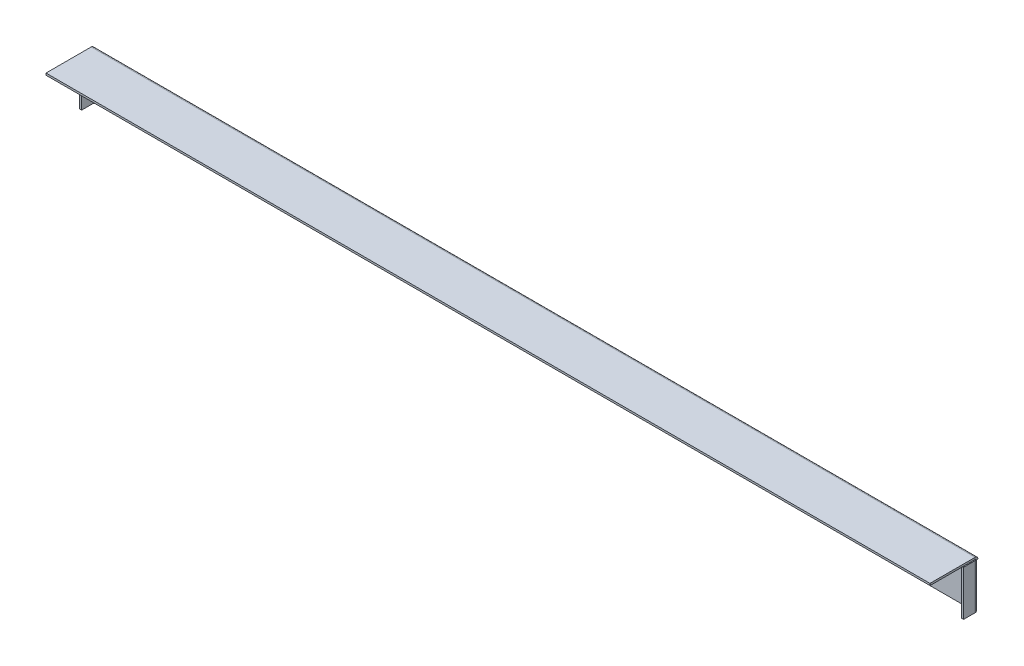
ISO-10303-21;
HEADER;
FILE_DESCRIPTION(('STEP AP214'),'2;1');
FILE_NAME('part.step','',(''),(''),'','','');
FILE_SCHEMA(('AUTOMOTIVE_DESIGN { 1 0 10303 214 1 1 1 1 }'));
ENDSEC;
DATA;
#1=APPLICATION_CONTEXT('core data for automotive mechanical design processes');
#2=APPLICATION_PROTOCOL_DEFINITION('international standard','automotive_design',2000,#1);
#3=PRODUCT_CONTEXT('',#1,'mechanical');
#4=PRODUCT('Part','Part','',(#3));
#5=PRODUCT_RELATED_PRODUCT_CATEGORY('part','',(#4));
#6=PRODUCT_DEFINITION_FORMATION('','',#4);
#7=PRODUCT_DEFINITION_CONTEXT('part definition',#1,'design');
#8=PRODUCT_DEFINITION('design','',#6,#7);
#9=PRODUCT_DEFINITION_SHAPE('','',#8);
#10=(LENGTH_UNIT() NAMED_UNIT(*) SI_UNIT(.MILLI.,.METRE.));
#11=(NAMED_UNIT(*) PLANE_ANGLE_UNIT() SI_UNIT($,.RADIAN.));
#12=(NAMED_UNIT(*) SI_UNIT($,.STERADIAN.) SOLID_ANGLE_UNIT());
#13=UNCERTAINTY_MEASURE_WITH_UNIT(LENGTH_MEASURE(1.E-05),#10,'distance_accuracy_value','');
#14=(GEOMETRIC_REPRESENTATION_CONTEXT(3) GLOBAL_UNCERTAINTY_ASSIGNED_CONTEXT((#13)) GLOBAL_UNIT_ASSIGNED_CONTEXT((#10,
#11,#12)) REPRESENTATION_CONTEXT('',''));
#15=CARTESIAN_POINT('',(0.,0.,0.));
#16=DIRECTION('',(0.,0.,1.));
#17=DIRECTION('',(1.,0.,0.));
#18=AXIS2_PLACEMENT_3D('',#15,#16,#17);
#19=CARTESIAN_POINT('',(-457.,-3.00000000000011,1.99999999999995));
#20=DIRECTION('',(0.,-1.,0.));
#21=DIRECTION('',(0.,0.,-1.));
#22=AXIS2_PLACEMENT_3D('',#19,#20,#21);
#23=PLANE('',#22);
#24=DIRECTION('',(-1.,0.,0.));
#25=VECTOR('',#24,1.);
#26=CARTESIAN_POINT('',(-460.,-3.00000000000012,0.));
#27=LINE('',#26,#25);
#28=CARTESIAN_POINT('',(-460.,-3.00000000000011,0.));
#29=VERTEX_POINT('',#28);
#30=CARTESIAN_POINT('',(-457.,-3.00000000000011,0.));
#31=VERTEX_POINT('',#30);
#32=EDGE_CURVE('E385',#29,#31,#27,.F.);
#33=ORIENTED_EDGE('',*,*,#32,.T.);
#34=CARTESIAN_POINT('',(-457.,-3.00000000000011,3.00000000000001));
#35=DIRECTION('',(0.,-1.,0.));
#36=DIRECTION('',(0.,0.,-1.));
#37=AXIS2_PLACEMENT_3D('',#34,#35,#36);
#38=CIRCLE('',#37,3.00000000000006);
#39=CARTESIAN_POINT('',(-459.828427124746,-3.00000000000011,2.));
#40=VERTEX_POINT('',#39);
#41=EDGE_CURVE('E284',#31,#40,#38,.F.);
#42=ORIENTED_EDGE('',*,*,#41,.T.);
#43=DIRECTION('',(-1.,0.,0.));
#44=VECTOR('',#43,1.);
#45=CARTESIAN_POINT('',(-460.,-3.00000000000012,2.));
#46=LINE('',#45,#44);
#47=CARTESIAN_POINT('',(-460.,-3.00000000000012,2.));
#48=VERTEX_POINT('',#47);
#49=EDGE_CURVE('E399',#48,#40,#46,.F.);
#50=ORIENTED_EDGE('',*,*,#49,.F.);
#51=DIRECTION('',(0.,0.,-1.));
#52=VECTOR('',#51,1.);
#53=CARTESIAN_POINT('',(-460.,-3.00000000000012,2.));
#54=LINE('',#53,#52);
#55=EDGE_CURVE('E392',#48,#29,#54,.T.);
#56=ORIENTED_EDGE('',*,*,#55,.T.);
#57=EDGE_LOOP('',(#33,#42,#50,#56));
#58=FACE_BOUND('',#57,.T.);
#59=ADVANCED_FACE('F99',(#58),#23,.T.);
#60=CARTESIAN_POINT('',(460.,-3.00000000000012,2.));
#61=DIRECTION('',(0.,-1.,0.));
#62=DIRECTION('',(0.,0.,-1.));
#63=AXIS2_PLACEMENT_3D('',#60,#61,#62);
#64=PLANE('',#63);
#65=DIRECTION('',(-1.,0.,0.));
#66=VECTOR('',#65,1.);
#67=CARTESIAN_POINT('',(460.,-3.00000000000012,2.));
#68=LINE('',#67,#66);
#69=CARTESIAN_POINT('',(460.,-3.00000000000012,2.));
#70=VERTEX_POINT('',#69);
#71=CARTESIAN_POINT('',(459.828427124746,-3.00000000000012,2.));
#72=VERTEX_POINT('',#71);
#73=EDGE_CURVE('E348',#70,#72,#68,.T.);
#74=ORIENTED_EDGE('',*,*,#73,.T.);
#75=CARTESIAN_POINT('',(457.,-3.00000000000012,3.00000000000001));
#76=DIRECTION('',(0.,1.,0.));
#77=DIRECTION('',(0.,0.,1.));
#78=AXIS2_PLACEMENT_3D('',#75,#76,#77);
#79=CIRCLE('',#78,3.);
#80=CARTESIAN_POINT('',(457.,-3.00000000000011,0.));
#81=VERTEX_POINT('',#80);
#82=EDGE_CURVE('E13',#72,#81,#79,.T.);
#83=ORIENTED_EDGE('',*,*,#82,.T.);
#84=DIRECTION('',(-1.,0.,0.));
#85=VECTOR('',#84,1.);
#86=CARTESIAN_POINT('',(-460.,-2.99999999999971,0.));
#87=LINE('',#86,#85);
#88=CARTESIAN_POINT('',(460.,-3.00000000000011,0.));
#89=VERTEX_POINT('',#88);
#90=EDGE_CURVE('E350',#89,#81,#87,.T.);
#91=ORIENTED_EDGE('',*,*,#90,.F.);
#92=DIRECTION('',(0.,0.,-1.));
#93=VECTOR('',#92,1.);
#94=CARTESIAN_POINT('',(460.,-3.00000000000012,2.));
#95=LINE('',#94,#93);
#96=EDGE_CURVE('E406',#70,#89,#95,.T.);
#97=ORIENTED_EDGE('',*,*,#96,.F.);
#98=EDGE_LOOP('',(#74,#83,#91,#97));
#99=FACE_BOUND('',#98,.T.);
#100=ADVANCED_FACE('F460',(#99),#64,.T.);
#101=CARTESIAN_POINT('',(0.,0.,2.));
#102=DIRECTION('',(0.,0.,-1.));
#103=DIRECTION('',(-1.,0.,0.));
#104=AXIS2_PLACEMENT_3D('',#101,#102,#103);
#105=PLANE('',#104);
#106=DIRECTION('',(0.,-1.,0.));
#107=VECTOR('',#106,1.);
#108=CARTESIAN_POINT('',(-457.,-50.0000000000001,1.99999999999995));
#109=LINE('',#108,#107);
#110=CARTESIAN_POINT('',(-457.,-50.0000000000001,1.99999999999995));
#111=VERTEX_POINT('',#110);
#112=CARTESIAN_POINT('',(-457.,-3.00000000000012,2.));
#113=VERTEX_POINT('',#112);
#114=EDGE_CURVE('E291',#111,#113,#109,.F.);
#115=ORIENTED_EDGE('',*,*,#114,.F.);
#116=DIRECTION('',(1.,0.,0.));
#117=VECTOR('',#116,1.);
#118=CARTESIAN_POINT('',(460.,-50.0000000000001,2.));
#119=LINE('',#118,#117);
#120=CARTESIAN_POINT('',(457.,-50.0000000000001,2.00000000000001));
#121=VERTEX_POINT('',#120);
#122=EDGE_CURVE('E108',#111,#121,#119,.T.);
#123=ORIENTED_EDGE('',*,*,#122,.T.);
#124=DIRECTION('',(0.,1.,0.));
#125=VECTOR('',#124,1.);
#126=CARTESIAN_POINT('',(457.,-3.00000000000012,2.00000000000001));
#127=LINE('',#126,#125);
#128=CARTESIAN_POINT('',(457.,-3.00000000000012,2.00000000000001));
#129=VERTEX_POINT('',#128);
#130=EDGE_CURVE('E341',#129,#121,#127,.F.);
#131=ORIENTED_EDGE('',*,*,#130,.F.);
#132=EDGE_CURVE('E403',#113,#129,#46,.F.);
#133=ORIENTED_EDGE('',*,*,#132,.F.);
#134=EDGE_LOOP('',(#115,#123,#131,#133));
#135=FACE_BOUND('',#134,.T.);
#136=ADVANCED_FACE('F467',(#135),#105,.F.);
#137=CARTESIAN_POINT('',(0.,0.,0.));
#138=DIRECTION('',(0.,0.,-1.));
#139=DIRECTION('',(-1.,0.,0.));
#140=AXIS2_PLACEMENT_3D('',#137,#138,#139);
#141=PLANE('',#140);
#142=DIRECTION('',(1.,0.,0.));
#143=VECTOR('',#142,1.);
#144=CARTESIAN_POINT('',(460.,-50.0000000000001,0.));
#145=LINE('',#144,#143);
#146=CARTESIAN_POINT('',(-457.,-50.0000000000001,0.));
#147=VERTEX_POINT('',#146);
#148=CARTESIAN_POINT('',(457.,-50.0000000000001,0.));
#149=VERTEX_POINT('',#148);
#150=EDGE_CURVE('E103',#147,#149,#145,.T.);
#151=ORIENTED_EDGE('',*,*,#150,.F.);
#152=DIRECTION('',(0.,-1.,0.));
#153=VECTOR('',#152,1.);
#154=CARTESIAN_POINT('',(-457.,-50.0000000000001,0.));
#155=LINE('',#154,#153);
#156=EDGE_CURVE('E279',#147,#31,#155,.F.);
#157=ORIENTED_EDGE('',*,*,#156,.T.);
#158=EDGE_CURVE('E389',#31,#81,#27,.F.);
#159=ORIENTED_EDGE('',*,*,#158,.T.);
#160=DIRECTION('',(0.,1.,0.));
#161=VECTOR('',#160,1.);
#162=CARTESIAN_POINT('',(457.,-3.00000000000012,0.));
#163=LINE('',#162,#161);
#164=EDGE_CURVE('E330',#81,#149,#163,.F.);
#165=ORIENTED_EDGE('',*,*,#164,.T.);
#166=EDGE_LOOP('',(#151,#157,#159,#165));
#167=FACE_BOUND('',#166,.T.);
#168=ADVANCED_FACE('F418',(#167),#141,.T.);
#169=CARTESIAN_POINT('',(460.,-50.0000000000001,2.));
#170=DIRECTION('',(0.,1.,0.));
#171=DIRECTION('',(0.,0.,1.));
#172=AXIS2_PLACEMENT_3D('',#169,#170,#171);
#173=PLANE('',#172);
#174=DIRECTION('',(0.,0.,-1.));
#175=VECTOR('',#174,1.);
#176=CARTESIAN_POINT('',(-457.,-50.0000000000001,1.99999999999995));
#177=LINE('',#176,#175);
#178=EDGE_CURVE('E287',#111,#147,#177,.T.);
#179=ORIENTED_EDGE('',*,*,#178,.T.);
#180=ORIENTED_EDGE('',*,*,#150,.T.);
#181=DIRECTION('',(0.,0.,-1.));
#182=VECTOR('',#181,1.);
#183=CARTESIAN_POINT('',(457.,-50.0000000000001,2.00000000000001));
#184=LINE('',#183,#182);
#185=EDGE_CURVE('E335',#121,#149,#184,.T.);
#186=ORIENTED_EDGE('',*,*,#185,.F.);
#187=ORIENTED_EDGE('',*,*,#122,.F.);
#188=EDGE_LOOP('',(#179,#180,#186,#187));
#189=FACE_BOUND('',#188,.T.);
#190=ADVANCED_FACE('F101',(#189),#173,.F.);
#191=CARTESIAN_POINT('',(460.,-3.00000000000012,3.));
#192=DIRECTION('',(1.,0.,0.));
#193=DIRECTION('',(0.,0.,-1.));
#194=AXIS2_PLACEMENT_3D('',#191,#192,#193);
#195=PLANE('',#194);
#196=DIRECTION('',(0.,1.,0.));
#197=VECTOR('',#196,1.);
#198=CARTESIAN_POINT('',(460.,-1.21408608931487E-13,2.99999999999999));
#199=LINE('',#198,#197);
#200=CARTESIAN_POINT('',(460.,-2.00000000000012,3.));
#201=VERTEX_POINT('',#200);
#202=CARTESIAN_POINT('',(460.,-1.21430643318376E-13,2.99999999999999));
#203=VERTEX_POINT('',#202);
#204=EDGE_CURVE('E353',#201,#203,#199,.T.);
#205=ORIENTED_EDGE('',*,*,#204,.F.);
#206=CARTESIAN_POINT('',(460.,-3.00000000000012,3.));
#207=DIRECTION('',(-1.,0.,0.));
#208=DIRECTION('',(0.,0.,1.));
#209=AXIS2_PLACEMENT_3D('',#206,#207,#208);
#210=CIRCLE('',#209,1.);
#211=EDGE_CURVE('E396',#70,#201,#210,.F.);
#212=ORIENTED_EDGE('',*,*,#211,.F.);
#213=ORIENTED_EDGE('',*,*,#96,.T.);
#214=CARTESIAN_POINT('',(460.,-3.00000000000012,3.));
#215=DIRECTION('',(-1.,0.,0.));
#216=DIRECTION('',(0.,0.,1.));
#217=AXIS2_PLACEMENT_3D('',#214,#215,#216);
#218=CIRCLE('',#217,3.);
#219=EDGE_CURVE('E388',#89,#203,#218,.F.);
#220=ORIENTED_EDGE('',*,*,#219,.T.);
#221=EDGE_LOOP('',(#205,#212,#213,#220));
#222=FACE_BOUND('',#221,.T.);
#223=ADVANCED_FACE('F502',(#222),#195,.T.);
#224=CARTESIAN_POINT('',(-460.,-3.00000000000012,3.));
#225=DIRECTION('',(1.,0.,0.));
#226=DIRECTION('',(0.,0.,-1.));
#227=AXIS2_PLACEMENT_3D('',#224,#225,#226);
#228=PLANE('',#227);
#229=CARTESIAN_POINT('',(-460.,-3.00000000000012,3.));
#230=DIRECTION('',(-1.,0.,0.));
#231=DIRECTION('',(0.,0.,1.));
#232=AXIS2_PLACEMENT_3D('',#229,#230,#231);
#233=CIRCLE('',#232,1.);
#234=CARTESIAN_POINT('',(-460.,-2.00000000000012,3.));
#235=VERTEX_POINT('',#234);
#236=EDGE_CURVE('E356',#235,#48,#233,.T.);
#237=ORIENTED_EDGE('',*,*,#236,.F.);
#238=DIRECTION('',(0.,1.,0.));
#239=VECTOR('',#238,1.);
#240=CARTESIAN_POINT('',(-460.,-2.00000000000012,3.00000000000001));
#241=LINE('',#240,#239);
#242=CARTESIAN_POINT('',(-460.,-1.21305697310961E-13,3.));
#243=VERTEX_POINT('',#242);
#244=EDGE_CURVE('E378',#235,#243,#241,.T.);
#245=ORIENTED_EDGE('',*,*,#244,.T.);
#246=CARTESIAN_POINT('',(-460.,-3.00000000000012,3.));
#247=DIRECTION('',(-1.,0.,0.));
#248=DIRECTION('',(0.,0.,1.));
#249=AXIS2_PLACEMENT_3D('',#246,#247,#248);
#250=CIRCLE('',#249,3.);
#251=EDGE_CURVE('E393',#243,#29,#250,.T.);
#252=ORIENTED_EDGE('',*,*,#251,.T.);
#253=ORIENTED_EDGE('',*,*,#55,.F.);
#254=EDGE_LOOP('',(#237,#245,#252,#253));
#255=FACE_BOUND('',#254,.T.);
#256=ADVANCED_FACE('F498',(#255),#228,.F.);
#257=CARTESIAN_POINT('',(-460.,-3.00000000000012,3.));
#258=DIRECTION('',(-1.,0.,0.));
#259=DIRECTION('',(0.,1.,0.));
#260=AXIS2_PLACEMENT_3D('',#257,#258,#259);
#261=CYLINDRICAL_SURFACE('',#260,3.);
#262=ORIENTED_EDGE('',*,*,#32,.F.);
#263=ORIENTED_EDGE('',*,*,#251,.F.);
#264=DIRECTION('',(-1.,0.,0.));
#265=VECTOR('',#264,1.);
#266=CARTESIAN_POINT('',(460.,-1.21430643318376E-13,2.99999999999999));
#267=LINE('',#266,#265);
#268=EDGE_CURVE('E376',#243,#203,#267,.F.);
#269=ORIENTED_EDGE('',*,*,#268,.T.);
#270=ORIENTED_EDGE('',*,*,#219,.F.);
#271=ORIENTED_EDGE('',*,*,#90,.T.);
#272=ORIENTED_EDGE('',*,*,#158,.F.);
#273=EDGE_LOOP('',(#262,#263,#269,#270,#271,#272));
#274=FACE_BOUND('',#273,.T.);
#275=ADVANCED_FACE('F495',(#274),#261,.T.);
#276=CARTESIAN_POINT('',(-460.,-3.00000000000012,3.));
#277=DIRECTION('',(-1.,0.,0.));
#278=DIRECTION('',(0.,1.,0.));
#279=AXIS2_PLACEMENT_3D('',#276,#277,#278);
#280=CYLINDRICAL_SURFACE('',#279,1.);
#281=ORIENTED_EDGE('',*,*,#49,.T.);
#282=EDGE_CURVE('E402',#40,#113,#46,.F.);
#283=ORIENTED_EDGE('',*,*,#282,.T.);
#284=ORIENTED_EDGE('',*,*,#132,.T.);
#285=EDGE_CURVE('E117',#72,#129,#68,.T.);
#286=ORIENTED_EDGE('',*,*,#285,.F.);
#287=ORIENTED_EDGE('',*,*,#73,.F.);
#288=ORIENTED_EDGE('',*,*,#211,.T.);
#289=DIRECTION('',(-1.,0.,0.));
#290=VECTOR('',#289,1.);
#291=CARTESIAN_POINT('',(460.,-2.00000000000012,3.));
#292=LINE('',#291,#290);
#293=EDGE_CURVE('E381',#201,#235,#292,.T.);
#294=ORIENTED_EDGE('',*,*,#293,.T.);
#295=ORIENTED_EDGE('',*,*,#236,.T.);
#296=EDGE_LOOP('',(#281,#283,#284,#286,#287,#288,#294,#295));
#297=FACE_BOUND('',#296,.T.);
#298=ADVANCED_FACE('F487',(#297),#280,.F.);
#299=CARTESIAN_POINT('',(-460.,0.,50.));
#300=DIRECTION('',(-1.,0.,0.));
#301=DIRECTION('',(0.,0.,1.));
#302=AXIS2_PLACEMENT_3D('',#299,#300,#301);
#303=PLANE('',#302);
#304=DIRECTION('',(0.,0.,1.));
#305=VECTOR('',#304,1.);
#306=CARTESIAN_POINT('',(-460.,0.,50.));
#307=LINE('',#306,#305);
#308=CARTESIAN_POINT('',(-460.,0.,50.));
#309=VERTEX_POINT('',#308);
#310=EDGE_CURVE('E360',#309,#243,#307,.F.);
#311=ORIENTED_EDGE('',*,*,#310,.T.);
#312=ORIENTED_EDGE('',*,*,#244,.F.);
#313=DIRECTION('',(0.,0.,-1.));
#314=VECTOR('',#313,1.);
#315=CARTESIAN_POINT('',(-460.,-2.00000000000013,0.));
#316=LINE('',#315,#314);
#317=CARTESIAN_POINT('',(-460.,-1.99999999999996,50.));
#318=VERTEX_POINT('',#317);
#319=EDGE_CURVE('E368',#318,#235,#316,.T.);
#320=ORIENTED_EDGE('',*,*,#319,.F.);
#321=DIRECTION('',(0.,-1.,0.));
#322=VECTOR('',#321,1.);
#323=CARTESIAN_POINT('',(-460.,0.,50.));
#324=LINE('',#323,#322);
#325=EDGE_CURVE('E354',#309,#318,#324,.T.);
#326=ORIENTED_EDGE('',*,*,#325,.F.);
#327=EDGE_LOOP('',(#311,#312,#320,#326));
#328=FACE_BOUND('',#327,.T.);
#329=ADVANCED_FACE('F484',(#328),#303,.T.);
#330=CARTESIAN_POINT('',(460.,-1.2490009027033E-13,1.99999999999999));
#331=DIRECTION('',(1.,0.,0.));
#332=DIRECTION('',(0.,0.,-1.));
#333=AXIS2_PLACEMENT_3D('',#330,#331,#332);
#334=PLANE('',#333);
#335=DIRECTION('',(0.,0.,1.));
#336=VECTOR('',#335,1.);
#337=CARTESIAN_POINT('',(460.,-2.00000000000013,0.));
#338=LINE('',#337,#336);
#339=CARTESIAN_POINT('',(460.,-1.99999999999996,50.));
#340=VERTEX_POINT('',#339);
#341=EDGE_CURVE('E374',#201,#340,#338,.T.);
#342=ORIENTED_EDGE('',*,*,#341,.F.);
#343=ORIENTED_EDGE('',*,*,#204,.T.);
#344=DIRECTION('',(0.,0.,-1.));
#345=VECTOR('',#344,1.);
#346=CARTESIAN_POINT('',(460.,-1.24856021496551E-13,1.99999999999999));
#347=LINE('',#346,#345);
#348=CARTESIAN_POINT('',(460.,0.,50.));
#349=VERTEX_POINT('',#348);
#350=EDGE_CURVE('E366',#203,#349,#347,.F.);
#351=ORIENTED_EDGE('',*,*,#350,.T.);
#352=DIRECTION('',(0.,-1.,0.));
#353=VECTOR('',#352,1.);
#354=CARTESIAN_POINT('',(460.,0.,50.));
#355=LINE('',#354,#353);
#356=EDGE_CURVE('E357',#349,#340,#355,.T.);
#357=ORIENTED_EDGE('',*,*,#356,.T.);
#358=EDGE_LOOP('',(#342,#343,#351,#357));
#359=FACE_BOUND('',#358,.T.);
#360=ADVANCED_FACE('F478',(#359),#334,.T.);
#361=CARTESIAN_POINT('',(0.,-1.31838984174237E-13,0.));
#362=DIRECTION('',(0.,-1.,0.));
#363=DIRECTION('',(0.,0.,-1.));
#364=AXIS2_PLACEMENT_3D('',#361,#362,#363);
#365=PLANE('',#364);
#366=ORIENTED_EDGE('',*,*,#268,.F.);
#367=ORIENTED_EDGE('',*,*,#310,.F.);
#368=DIRECTION('',(1.,0.,0.));
#369=VECTOR('',#368,1.);
#370=CARTESIAN_POINT('',(460.,0.,50.));
#371=LINE('',#370,#369);
#372=EDGE_CURVE('E363',#349,#309,#371,.F.);
#373=ORIENTED_EDGE('',*,*,#372,.F.);
#374=ORIENTED_EDGE('',*,*,#350,.F.);
#375=EDGE_LOOP('',(#366,#367,#373,#374));
#376=FACE_BOUND('',#375,.T.);
#377=ADVANCED_FACE('F474',(#376),#365,.F.);
#378=CARTESIAN_POINT('',(0.,-2.00000000000013,0.));
#379=DIRECTION('',(0.,-1.,0.));
#380=DIRECTION('',(0.,0.,-1.));
#381=AXIS2_PLACEMENT_3D('',#378,#379,#380);
#382=PLANE('',#381);
#383=ORIENTED_EDGE('',*,*,#319,.T.);
#384=ORIENTED_EDGE('',*,*,#293,.F.);
#385=ORIENTED_EDGE('',*,*,#341,.T.);
#386=DIRECTION('',(-1.,0.,0.));
#387=VECTOR('',#386,1.);
#388=CARTESIAN_POINT('',(0.,-1.99999999999996,50.));
#389=LINE('',#388,#387);
#390=EDGE_CURVE('E371',#340,#318,#389,.T.);
#391=ORIENTED_EDGE('',*,*,#390,.T.);
#392=EDGE_LOOP('',(#383,#384,#385,#391));
#393=FACE_BOUND('',#392,.T.);
#394=ADVANCED_FACE('F477',(#393),#382,.T.);
#395=CARTESIAN_POINT('',(460.,0.,50.));
#396=DIRECTION('',(0.,0.,1.));
#397=DIRECTION('',(0.,-1.,0.));
#398=AXIS2_PLACEMENT_3D('',#395,#396,#397);
#399=PLANE('',#398);
#400=ORIENTED_EDGE('',*,*,#390,.F.);
#401=ORIENTED_EDGE('',*,*,#356,.F.);
#402=ORIENTED_EDGE('',*,*,#372,.T.);
#403=ORIENTED_EDGE('',*,*,#325,.T.);
#404=EDGE_LOOP('',(#400,#401,#402,#403));
#405=FACE_BOUND('',#404,.T.);
#406=ADVANCED_FACE('F482',(#405),#399,.T.);
#407=CARTESIAN_POINT('',(457.,-50.0000000000001,3.00000000000001));
#408=DIRECTION('',(0.,-1.,0.));
#409=DIRECTION('',(0.,0.,-1.));
#410=AXIS2_PLACEMENT_3D('',#407,#408,#409);
#411=PLANE('',#410);
#412=DIRECTION('',(1.,0.,0.));
#413=VECTOR('',#412,1.);
#414=CARTESIAN_POINT('',(460.,-50.0000000000001,2.99999999999999));
#415=LINE('',#414,#413);
#416=CARTESIAN_POINT('',(458.,-50.0000000000001,3.));
#417=VERTEX_POINT('',#416);
#418=CARTESIAN_POINT('',(460.,-50.0000000000001,2.99999999999999));
#419=VERTEX_POINT('',#418);
#420=EDGE_CURVE('E297',#417,#419,#415,.T.);
#421=ORIENTED_EDGE('',*,*,#420,.F.);
#422=CARTESIAN_POINT('',(457.,-50.0000000000001,3.00000000000001));
#423=DIRECTION('',(0.,1.,0.));
#424=DIRECTION('',(0.,0.,1.));
#425=AXIS2_PLACEMENT_3D('',#422,#423,#424);
#426=CIRCLE('',#425,1.);
#427=EDGE_CURVE('E338',#121,#417,#426,.F.);
#428=ORIENTED_EDGE('',*,*,#427,.F.);
#429=ORIENTED_EDGE('',*,*,#185,.T.);
#430=CARTESIAN_POINT('',(457.,-50.0000000000001,3.00000000000001));
#431=DIRECTION('',(0.,1.,0.));
#432=DIRECTION('',(0.,0.,1.));
#433=AXIS2_PLACEMENT_3D('',#430,#431,#432);
#434=CIRCLE('',#433,3.);
#435=EDGE_CURVE('E333',#149,#419,#434,.F.);
#436=ORIENTED_EDGE('',*,*,#435,.T.);
#437=EDGE_LOOP('',(#421,#428,#429,#436));
#438=FACE_BOUND('',#437,.T.);
#439=ADVANCED_FACE('F425',(#438),#411,.T.);
#440=CARTESIAN_POINT('',(457.,-3.00000000000012,3.00000000000001));
#441=DIRECTION('',(0.,-1.,0.));
#442=DIRECTION('',(0.,0.,-1.));
#443=AXIS2_PLACEMENT_3D('',#440,#441,#442);
#444=PLANE('',#443);
#445=CARTESIAN_POINT('',(460.,-3.00000000000012,2.99999999999999));
#446=VERTEX_POINT('',#445);
#447=EDGE_CURVE('E110',#446,#72,#79,.T.);
#448=ORIENTED_EDGE('',*,*,#447,.T.);
#449=ORIENTED_EDGE('',*,*,#285,.T.);
#450=CARTESIAN_POINT('',(457.,-3.00000000000012,3.00000000000001));
#451=DIRECTION('',(0.,1.,0.));
#452=DIRECTION('',(0.,0.,1.));
#453=AXIS2_PLACEMENT_3D('',#450,#451,#452);
#454=CIRCLE('',#453,1.);
#455=CARTESIAN_POINT('',(458.,-3.00000000000012,3.));
#456=VERTEX_POINT('',#455);
#457=EDGE_CURVE('E300',#456,#129,#454,.T.);
#458=ORIENTED_EDGE('',*,*,#457,.F.);
#459=DIRECTION('',(1.,0.,0.));
#460=VECTOR('',#459,1.);
#461=CARTESIAN_POINT('',(458.,-3.00000000000012,3.));
#462=LINE('',#461,#460);
#463=EDGE_CURVE('E323',#456,#446,#462,.T.);
#464=ORIENTED_EDGE('',*,*,#463,.T.);
#465=EDGE_LOOP('',(#448,#449,#458,#464));
#466=FACE_BOUND('',#465,.T.);
#467=ADVANCED_FACE('F471',(#466),#444,.F.);
#468=CARTESIAN_POINT('',(457.,-3.00000000000012,3.00000000000001));
#469=DIRECTION('',(0.,1.,0.));
#470=DIRECTION('',(1.,0.,0.));
#471=AXIS2_PLACEMENT_3D('',#468,#469,#470);
#472=CYLINDRICAL_SURFACE('',#471,3.);
#473=ORIENTED_EDGE('',*,*,#164,.F.);
#474=ORIENTED_EDGE('',*,*,#82,.F.);
#475=ORIENTED_EDGE('',*,*,#447,.F.);
#476=DIRECTION('',(0.,1.,0.));
#477=VECTOR('',#476,1.);
#478=CARTESIAN_POINT('',(460.,-5.43300629071885E-13,2.99999999999999));
#479=LINE('',#478,#477);
#480=EDGE_CURVE('E320',#419,#446,#479,.T.);
#481=ORIENTED_EDGE('',*,*,#480,.F.);
#482=ORIENTED_EDGE('',*,*,#435,.F.);
#483=EDGE_LOOP('',(#473,#474,#475,#481,#482));
#484=FACE_BOUND('',#483,.T.);
#485=ADVANCED_FACE('F426',(#484),#472,.T.);
#486=CARTESIAN_POINT('',(457.,-3.00000000000012,3.00000000000001));
#487=DIRECTION('',(0.,1.,0.));
#488=DIRECTION('',(1.,0.,0.));
#489=AXIS2_PLACEMENT_3D('',#486,#487,#488);
#490=CYLINDRICAL_SURFACE('',#489,1.);
#491=ORIENTED_EDGE('',*,*,#130,.T.);
#492=ORIENTED_EDGE('',*,*,#427,.T.);
#493=DIRECTION('',(0.,-1.,0.));
#494=VECTOR('',#493,1.);
#495=CARTESIAN_POINT('',(458.,-50.0000000000001,3.));
#496=LINE('',#495,#494);
#497=EDGE_CURVE('E326',#417,#456,#496,.F.);
#498=ORIENTED_EDGE('',*,*,#497,.T.);
#499=ORIENTED_EDGE('',*,*,#457,.T.);
#500=EDGE_LOOP('',(#491,#492,#498,#499));
#501=FACE_BOUND('',#500,.T.);
#502=ADVANCED_FACE('F445',(#501),#490,.F.);
#503=CARTESIAN_POINT('',(460.,-3.00000000000012,2.));
#504=DIRECTION('',(0.,1.,0.));
#505=DIRECTION('',(-1.,0.,0.));
#506=AXIS2_PLACEMENT_3D('',#503,#504,#505);
#507=PLANE('',#506);
#508=DIRECTION('',(0.,0.,-1.));
#509=VECTOR('',#508,1.);
#510=CARTESIAN_POINT('',(460.,-3.00000000000012,2.));
#511=LINE('',#510,#509);
#512=CARTESIAN_POINT('',(460.,-3.00000000000012,15.));
#513=VERTEX_POINT('',#512);
#514=EDGE_CURVE('E304',#513,#446,#511,.T.);
#515=ORIENTED_EDGE('',*,*,#514,.T.);
#516=ORIENTED_EDGE('',*,*,#463,.F.);
#517=DIRECTION('',(0.,0.,1.));
#518=VECTOR('',#517,1.);
#519=CARTESIAN_POINT('',(458.,-3.00000000000012,-1.9640405754742E-12));
#520=LINE('',#519,#518);
#521=CARTESIAN_POINT('',(458.,-3.00000000000012,15.));
#522=VERTEX_POINT('',#521);
#523=EDGE_CURVE('E312',#522,#456,#520,.F.);
#524=ORIENTED_EDGE('',*,*,#523,.F.);
#525=DIRECTION('',(-1.,0.,0.));
#526=VECTOR('',#525,1.);
#527=CARTESIAN_POINT('',(460.,-3.00000000000012,15.));
#528=LINE('',#527,#526);
#529=EDGE_CURVE('E298',#513,#522,#528,.T.);
#530=ORIENTED_EDGE('',*,*,#529,.F.);
#531=EDGE_LOOP('',(#515,#516,#524,#530));
#532=FACE_BOUND('',#531,.T.);
#533=ADVANCED_FACE('F434',(#532),#507,.T.);
#534=CARTESIAN_POINT('',(460.,-50.0000000000001,15.));
#535=DIRECTION('',(0.,-1.,0.));
#536=DIRECTION('',(1.,0.,0.));
#537=AXIS2_PLACEMENT_3D('',#534,#535,#536);
#538=PLANE('',#537);
#539=DIRECTION('',(0.,0.,-1.));
#540=VECTOR('',#539,1.);
#541=CARTESIAN_POINT('',(458.,-50.0000000000001,-1.96424073587528E-12));
#542=LINE('',#541,#540);
#543=CARTESIAN_POINT('',(458.,-50.0000000000001,15.));
#544=VERTEX_POINT('',#543);
#545=EDGE_CURVE('E318',#417,#544,#542,.F.);
#546=ORIENTED_EDGE('',*,*,#545,.F.);
#547=ORIENTED_EDGE('',*,*,#420,.T.);
#548=DIRECTION('',(0.,0.,1.));
#549=VECTOR('',#548,1.);
#550=CARTESIAN_POINT('',(460.,-50.0000000000001,15.));
#551=LINE('',#550,#549);
#552=CARTESIAN_POINT('',(460.,-50.0000000000001,15.));
#553=VERTEX_POINT('',#552);
#554=EDGE_CURVE('E310',#419,#553,#551,.T.);
#555=ORIENTED_EDGE('',*,*,#554,.T.);
#556=DIRECTION('',(-1.,0.,0.));
#557=VECTOR('',#556,1.);
#558=CARTESIAN_POINT('',(460.,-50.0000000000001,15.));
#559=LINE('',#558,#557);
#560=EDGE_CURVE('E301',#553,#544,#559,.T.);
#561=ORIENTED_EDGE('',*,*,#560,.T.);
#562=EDGE_LOOP('',(#546,#547,#555,#561));
#563=FACE_BOUND('',#562,.T.);
#564=ADVANCED_FACE('F442',(#563),#538,.T.);
#565=CARTESIAN_POINT('',(460.,-5.43300629071885E-13,-1.97122369855296E-12));
#566=DIRECTION('',(1.,0.,0.));
#567=DIRECTION('',(0.,0.,-1.));
#568=AXIS2_PLACEMENT_3D('',#565,#566,#567);
#569=PLANE('',#568);
#570=ORIENTED_EDGE('',*,*,#554,.F.);
#571=ORIENTED_EDGE('',*,*,#480,.T.);
#572=ORIENTED_EDGE('',*,*,#514,.F.);
#573=DIRECTION('',(0.,1.,0.));
#574=VECTOR('',#573,1.);
#575=CARTESIAN_POINT('',(460.,-3.00000000000012,15.));
#576=LINE('',#575,#574);
#577=EDGE_CURVE('E307',#553,#513,#576,.T.);
#578=ORIENTED_EDGE('',*,*,#577,.F.);
#579=EDGE_LOOP('',(#570,#571,#572,#578));
#580=FACE_BOUND('',#579,.T.);
#581=ADVANCED_FACE('F430',(#580),#569,.T.);
#582=CARTESIAN_POINT('',(458.,-5.40938452423746E-13,-1.96424073587528E-12));
#583=DIRECTION('',(1.,0.,0.));
#584=DIRECTION('',(0.,0.,-1.));
#585=AXIS2_PLACEMENT_3D('',#582,#583,#584);
#586=PLANE('',#585);
#587=ORIENTED_EDGE('',*,*,#497,.F.);
#588=ORIENTED_EDGE('',*,*,#545,.T.);
#589=DIRECTION('',(0.,-1.,0.));
#590=VECTOR('',#589,1.);
#591=CARTESIAN_POINT('',(458.,-5.42599357879469E-13,15.));
#592=LINE('',#591,#590);
#593=EDGE_CURVE('E315',#544,#522,#592,.F.);
#594=ORIENTED_EDGE('',*,*,#593,.T.);
#595=ORIENTED_EDGE('',*,*,#523,.T.);
#596=EDGE_LOOP('',(#587,#588,#594,#595));
#597=FACE_BOUND('',#596,.T.);
#598=ADVANCED_FACE('F448',(#597),#586,.F.);
#599=CARTESIAN_POINT('',(460.,-3.00000000000012,15.));
#600=DIRECTION('',(0.,0.,1.));
#601=DIRECTION('',(1.,0.,0.));
#602=AXIS2_PLACEMENT_3D('',#599,#600,#601);
#603=PLANE('',#602);
#604=ORIENTED_EDGE('',*,*,#593,.F.);
#605=ORIENTED_EDGE('',*,*,#560,.F.);
#606=ORIENTED_EDGE('',*,*,#577,.T.);
#607=ORIENTED_EDGE('',*,*,#529,.T.);
#608=EDGE_LOOP('',(#604,#605,#606,#607));
#609=FACE_BOUND('',#608,.T.);
#610=ADVANCED_FACE('F439',(#609),#603,.T.);
#611=CARTESIAN_POINT('',(-457.,-3.00000000000011,3.00000000000001));
#612=DIRECTION('',(0.,1.,0.));
#613=DIRECTION('',(0.,0.,1.));
#614=AXIS2_PLACEMENT_3D('',#611,#612,#613);
#615=PLANE('',#614);
#616=ORIENTED_EDGE('',*,*,#282,.F.);
#617=CARTESIAN_POINT('',(-460.,-3.00000000000011,2.99999999999999));
#618=VERTEX_POINT('',#617);
#619=EDGE_CURVE('E282',#40,#618,#38,.F.);
#620=ORIENTED_EDGE('',*,*,#619,.T.);
#621=DIRECTION('',(-1.,0.,0.));
#622=VECTOR('',#621,1.);
#623=CARTESIAN_POINT('',(-460.,-3.00000000000012,2.99999999999999));
#624=LINE('',#623,#622);
#625=CARTESIAN_POINT('',(-458.,-3.00000000000011,3.));
#626=VERTEX_POINT('',#625);
#627=EDGE_CURVE('E276',#626,#618,#624,.T.);
#628=ORIENTED_EDGE('',*,*,#627,.F.);
#629=CARTESIAN_POINT('',(-457.,-3.00000000000011,3.00000000000001));
#630=DIRECTION('',(0.,-1.,0.));
#631=DIRECTION('',(0.,0.,-1.));
#632=AXIS2_PLACEMENT_3D('',#629,#630,#631);
#633=CIRCLE('',#632,1.00000000000006);
#634=EDGE_CURVE('E125',#113,#626,#633,.F.);
#635=ORIENTED_EDGE('',*,*,#634,.F.);
#636=EDGE_LOOP('',(#616,#620,#628,#635));
#637=FACE_BOUND('',#636,.T.);
#638=ADVANCED_FACE('F455',(#637),#615,.T.);
#639=CARTESIAN_POINT('',(-457.,-50.0000000000001,3.00000000000001));
#640=DIRECTION('',(0.,1.,0.));
#641=DIRECTION('',(0.,0.,1.));
#642=AXIS2_PLACEMENT_3D('',#639,#640,#641);
#643=PLANE('',#642);
#644=CARTESIAN_POINT('',(-457.,-50.0000000000001,3.00000000000001));
#645=DIRECTION('',(0.,-1.,0.));
#646=DIRECTION('',(0.,0.,-1.));
#647=AXIS2_PLACEMENT_3D('',#644,#645,#646);
#648=CIRCLE('',#647,1.00000000000006);
#649=CARTESIAN_POINT('',(-458.,-50.0000000000001,3.));
#650=VERTEX_POINT('',#649);
#651=EDGE_CURVE('E245',#650,#111,#648,.T.);
#652=ORIENTED_EDGE('',*,*,#651,.F.);
#653=DIRECTION('',(-1.,0.,0.));
#654=VECTOR('',#653,1.);
#655=CARTESIAN_POINT('',(-458.,-50.0000000000001,3.));
#656=LINE('',#655,#654);
#657=CARTESIAN_POINT('',(-460.,-50.0000000000001,2.99999999999999));
#658=VERTEX_POINT('',#657);
#659=EDGE_CURVE('E271',#650,#658,#656,.T.);
#660=ORIENTED_EDGE('',*,*,#659,.T.);
#661=CARTESIAN_POINT('',(-457.,-50.0000000000001,3.00000000000001));
#662=DIRECTION('',(0.,-1.,0.));
#663=DIRECTION('',(0.,0.,-1.));
#664=AXIS2_PLACEMENT_3D('',#661,#662,#663);
#665=CIRCLE('',#664,3.00000000000006);
#666=EDGE_CURVE('E283',#658,#147,#665,.T.);
#667=ORIENTED_EDGE('',*,*,#666,.T.);
#668=ORIENTED_EDGE('',*,*,#178,.F.);
#669=EDGE_LOOP('',(#652,#660,#667,#668));
#670=FACE_BOUND('',#669,.T.);
#671=ADVANCED_FACE('F611',(#670),#643,.F.);
#672=CARTESIAN_POINT('',(-457.,-50.0000000000001,3.00000000000001));
#673=DIRECTION('',(0.,-1.,0.));
#674=DIRECTION('',(-1.,0.,0.));
#675=AXIS2_PLACEMENT_3D('',#672,#673,#674);
#676=CYLINDRICAL_SURFACE('',#675,3.00000000000006);
#677=ORIENTED_EDGE('',*,*,#156,.F.);
#678=ORIENTED_EDGE('',*,*,#666,.F.);
#679=DIRECTION('',(0.,-1.,0.));
#680=VECTOR('',#679,1.);
#681=CARTESIAN_POINT('',(-460.,-3.00000000000012,2.99999999999999));
#682=LINE('',#681,#680);
#683=EDGE_CURVE('E255',#658,#618,#682,.F.);
#684=ORIENTED_EDGE('',*,*,#683,.T.);
#685=ORIENTED_EDGE('',*,*,#619,.F.);
#686=ORIENTED_EDGE('',*,*,#41,.F.);
#687=EDGE_LOOP('',(#677,#678,#684,#685,#686));
#688=FACE_BOUND('',#687,.T.);
#689=ADVANCED_FACE('F621',(#688),#676,.T.);
#690=CARTESIAN_POINT('',(-457.,-50.0000000000001,3.00000000000001));
#691=DIRECTION('',(0.,-1.,0.));
#692=DIRECTION('',(-1.,0.,0.));
#693=AXIS2_PLACEMENT_3D('',#690,#691,#692);
#694=CYLINDRICAL_SURFACE('',#693,1.00000000000006);
#695=ORIENTED_EDGE('',*,*,#114,.T.);
#696=ORIENTED_EDGE('',*,*,#634,.T.);
#697=DIRECTION('',(0.,-1.,0.));
#698=VECTOR('',#697,1.);
#699=CARTESIAN_POINT('',(-458.,-3.00000000000012,3.));
#700=LINE('',#699,#698);
#701=EDGE_CURVE('E274',#626,#650,#700,.T.);
#702=ORIENTED_EDGE('',*,*,#701,.T.);
#703=ORIENTED_EDGE('',*,*,#651,.T.);
#704=EDGE_LOOP('',(#695,#696,#702,#703));
#705=FACE_BOUND('',#704,.T.);
#706=ADVANCED_FACE('F632',(#705),#694,.F.);
#707=CARTESIAN_POINT('',(-460.,-3.00000000000012,2.));
#708=DIRECTION('',(0.,1.,0.));
#709=DIRECTION('',(-1.,0.,0.));
#710=AXIS2_PLACEMENT_3D('',#707,#708,#709);
#711=PLANE('',#710);
#712=DIRECTION('',(0.,0.,1.));
#713=VECTOR('',#712,1.);
#714=CARTESIAN_POINT('',(-458.,-3.00000000000012,-1.96444089627635E-12));
#715=LINE('',#714,#713);
#716=CARTESIAN_POINT('',(-458.,-3.00000000000012,15.));
#717=VERTEX_POINT('',#716);
#718=EDGE_CURVE('E268',#626,#717,#715,.T.);
#719=ORIENTED_EDGE('',*,*,#718,.F.);
#720=ORIENTED_EDGE('',*,*,#627,.T.);
#721=DIRECTION('',(0.,0.,-1.));
#722=VECTOR('',#721,1.);
#723=CARTESIAN_POINT('',(-460.,-3.00000000000012,2.));
#724=LINE('',#723,#722);
#725=CARTESIAN_POINT('',(-460.,-3.00000000000012,15.));
#726=VERTEX_POINT('',#725);
#727=EDGE_CURVE('E260',#618,#726,#724,.F.);
#728=ORIENTED_EDGE('',*,*,#727,.T.);
#729=DIRECTION('',(1.,0.,0.));
#730=VECTOR('',#729,1.);
#731=CARTESIAN_POINT('',(-460.,-3.00000000000012,15.));
#732=LINE('',#731,#730);
#733=EDGE_CURVE('E246',#726,#717,#732,.T.);
#734=ORIENTED_EDGE('',*,*,#733,.T.);
#735=EDGE_LOOP('',(#719,#720,#728,#734));
#736=FACE_BOUND('',#735,.T.);
#737=ADVANCED_FACE('F643',(#736),#711,.T.);
#738=CARTESIAN_POINT('',(-460.,-50.0000000000001,15.));
#739=DIRECTION('',(0.,-1.,0.));
#740=DIRECTION('',(1.,0.,0.));
#741=AXIS2_PLACEMENT_3D('',#738,#739,#740);
#742=PLANE('',#741);
#743=DIRECTION('',(0.,0.,1.));
#744=VECTOR('',#743,1.);
#745=CARTESIAN_POINT('',(-460.,-50.0000000000001,15.));
#746=LINE('',#745,#744);
#747=CARTESIAN_POINT('',(-460.,-50.0000000000001,15.));
#748=VERTEX_POINT('',#747);
#749=EDGE_CURVE('E238',#748,#658,#746,.F.);
#750=ORIENTED_EDGE('',*,*,#749,.T.);
#751=ORIENTED_EDGE('',*,*,#659,.F.);
#752=DIRECTION('',(0.,0.,-1.));
#753=VECTOR('',#752,1.);
#754=CARTESIAN_POINT('',(-458.,-50.0000000000001,-1.96424073587528E-12));
#755=LINE('',#754,#753);
#756=CARTESIAN_POINT('',(-458.,-50.0000000000001,15.));
#757=VERTEX_POINT('',#756);
#758=EDGE_CURVE('E240',#757,#650,#755,.T.);
#759=ORIENTED_EDGE('',*,*,#758,.F.);
#760=DIRECTION('',(1.,0.,0.));
#761=VECTOR('',#760,1.);
#762=CARTESIAN_POINT('',(-460.,-50.0000000000001,15.));
#763=LINE('',#762,#761);
#764=EDGE_CURVE('E234',#748,#757,#763,.T.);
#765=ORIENTED_EDGE('',*,*,#764,.F.);
#766=EDGE_LOOP('',(#750,#751,#759,#765));
#767=FACE_BOUND('',#766,.T.);
#768=ADVANCED_FACE('F236',(#767),#742,.T.);
#769=CARTESIAN_POINT('',(-460.,-5.43300629071885E-13,-1.97122369855296E-12));
#770=DIRECTION('',(1.,0.,0.));
#771=DIRECTION('',(0.,0.,-1.));
#772=AXIS2_PLACEMENT_3D('',#769,#770,#771);
#773=PLANE('',#772);
#774=ORIENTED_EDGE('',*,*,#683,.F.);
#775=ORIENTED_EDGE('',*,*,#749,.F.);
#776=DIRECTION('',(0.,1.,0.));
#777=VECTOR('',#776,1.);
#778=CARTESIAN_POINT('',(-460.,-3.00000000000012,15.));
#779=LINE('',#778,#777);
#780=EDGE_CURVE('E253',#726,#748,#779,.F.);
#781=ORIENTED_EDGE('',*,*,#780,.F.);
#782=ORIENTED_EDGE('',*,*,#727,.F.);
#783=EDGE_LOOP('',(#774,#775,#781,#782));
#784=FACE_BOUND('',#783,.T.);
#785=ADVANCED_FACE('F251',(#784),#773,.F.);
#786=CARTESIAN_POINT('',(-458.,-5.40938452423746E-13,-1.96424073587528E-12));
#787=DIRECTION('',(1.,0.,0.));
#788=DIRECTION('',(0.,0.,-1.));
#789=AXIS2_PLACEMENT_3D('',#786,#787,#788);
#790=PLANE('',#789);
#791=ORIENTED_EDGE('',*,*,#758,.T.);
#792=ORIENTED_EDGE('',*,*,#701,.F.);
#793=ORIENTED_EDGE('',*,*,#718,.T.);
#794=DIRECTION('',(0.,-1.,0.));
#795=VECTOR('',#794,1.);
#796=CARTESIAN_POINT('',(-458.,-5.42599357879469E-13,15.));
#797=LINE('',#796,#795);
#798=EDGE_CURVE('E266',#717,#757,#797,.T.);
#799=ORIENTED_EDGE('',*,*,#798,.T.);
#800=EDGE_LOOP('',(#791,#792,#793,#799));
#801=FACE_BOUND('',#800,.T.);
#802=ADVANCED_FACE('F673',(#801),#790,.T.);
#803=CARTESIAN_POINT('',(-460.,-3.00000000000012,15.));
#804=DIRECTION('',(0.,0.,1.));
#805=DIRECTION('',(1.,0.,0.));
#806=AXIS2_PLACEMENT_3D('',#803,#804,#805);
#807=PLANE('',#806);
#808=ORIENTED_EDGE('',*,*,#798,.F.);
#809=ORIENTED_EDGE('',*,*,#733,.F.);
#810=ORIENTED_EDGE('',*,*,#780,.T.);
#811=ORIENTED_EDGE('',*,*,#764,.T.);
#812=EDGE_LOOP('',(#808,#809,#810,#811));
#813=FACE_BOUND('',#812,.T.);
#814=ADVANCED_FACE('F258',(#813),#807,.T.);
#815=CLOSED_SHELL('',(#59,#100,#136,#168,#190,#223,#256,#275,#298,#329,#360,#377,#394,#406,#439,
#467,#485,#502,#533,#564,#581,#598,#610,#638,#671,#689,#706,#737,#768,#785,#802,#814));
#816=MANIFOLD_SOLID_BREP('B2',#815);
#817=ADVANCED_BREP_SHAPE_REPRESENTATION('',(#18,#816),#14);
#818=SHAPE_DEFINITION_REPRESENTATION(#9,#817);
ENDSEC;
END-ISO-10303-21;
